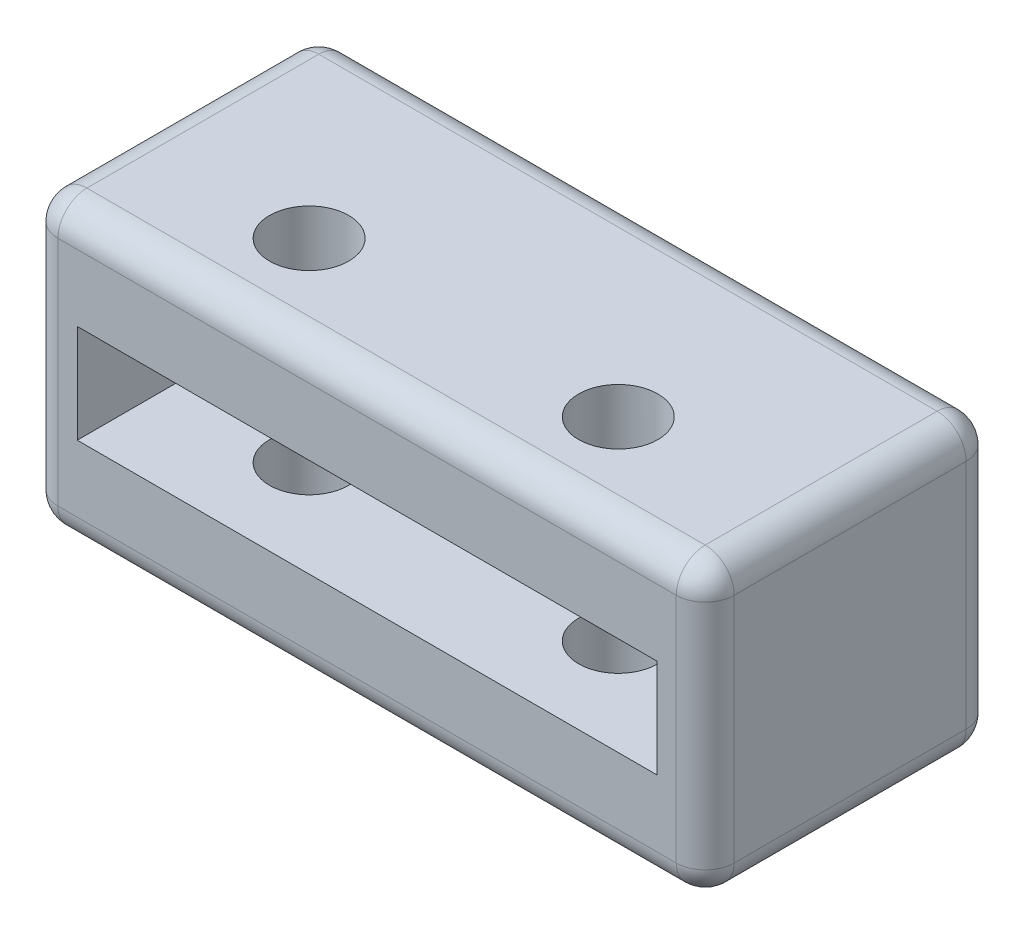
ISO-10303-21;
HEADER;
FILE_DESCRIPTION(('STEP AP214'),'2;1');
FILE_NAME('part.step','',(''),(''),'','','');
FILE_SCHEMA(('AUTOMOTIVE_DESIGN { 1 0 10303 214 1 1 1 1 }'));
ENDSEC;
DATA;
#1=APPLICATION_CONTEXT('core data for automotive mechanical design processes');
#2=APPLICATION_PROTOCOL_DEFINITION('international standard','automotive_design',2000,#1);
#3=PRODUCT_CONTEXT('',#1,'mechanical');
#4=PRODUCT('Part','Part','',(#3));
#5=PRODUCT_RELATED_PRODUCT_CATEGORY('part','',(#4));
#6=PRODUCT_DEFINITION_FORMATION('','',#4);
#7=PRODUCT_DEFINITION_CONTEXT('part definition',#1,'design');
#8=PRODUCT_DEFINITION('design','',#6,#7);
#9=PRODUCT_DEFINITION_SHAPE('','',#8);
#10=(LENGTH_UNIT() NAMED_UNIT(*) SI_UNIT(.MILLI.,.METRE.));
#11=(NAMED_UNIT(*) PLANE_ANGLE_UNIT() SI_UNIT($,.RADIAN.));
#12=(NAMED_UNIT(*) SI_UNIT($,.STERADIAN.) SOLID_ANGLE_UNIT());
#13=UNCERTAINTY_MEASURE_WITH_UNIT(LENGTH_MEASURE(1.E-05),#10,'distance_accuracy_value','');
#14=(GEOMETRIC_REPRESENTATION_CONTEXT(3) GLOBAL_UNCERTAINTY_ASSIGNED_CONTEXT((#13)) GLOBAL_UNIT_ASSIGNED_CONTEXT((#10,
#11,#12)) REPRESENTATION_CONTEXT('',''));
#15=CARTESIAN_POINT('',(0.,0.,0.));
#16=DIRECTION('',(0.,0.,1.));
#17=DIRECTION('',(1.,0.,0.));
#18=AXIS2_PLACEMENT_3D('',#15,#16,#17);
#19=CARTESIAN_POINT('',(35.,7.5,-6.));
#20=DIRECTION('',(0.,-1.,0.));
#21=DIRECTION('',(0.,0.,-1.));
#22=AXIS2_PLACEMENT_3D('',#19,#20,#21);
#23=PLANE('',#22);
#24=DIRECTION('',(-1.,0.,0.));
#25=VECTOR('',#24,1.);
#26=CARTESIAN_POINT('',(35.,7.5,6.));
#27=LINE('',#26,#25);
#28=CARTESIAN_POINT('',(33.5,7.5,6.));
#29=VERTEX_POINT('',#28);
#30=CARTESIAN_POINT('',(1.5,7.5,6.));
#31=VERTEX_POINT('',#30);
#32=EDGE_CURVE('E216',#29,#31,#27,.T.);
#33=ORIENTED_EDGE('',*,*,#32,.F.);
#34=DIRECTION('',(0.,0.,1.));
#35=VECTOR('',#34,1.);
#36=CARTESIAN_POINT('',(33.5,7.5,-6.));
#37=LINE('',#36,#35);
#38=CARTESIAN_POINT('',(33.5,7.5,-6.));
#39=VERTEX_POINT('',#38);
#40=EDGE_CURVE('E247',#29,#39,#37,.F.);
#41=ORIENTED_EDGE('',*,*,#40,.T.);
#42=DIRECTION('',(-1.,0.,0.));
#43=VECTOR('',#42,1.);
#44=CARTESIAN_POINT('',(35.,7.5,-6.));
#45=LINE('',#44,#43);
#46=CARTESIAN_POINT('',(1.5,7.5,-6.));
#47=VERTEX_POINT('',#46);
#48=EDGE_CURVE('E219',#39,#47,#45,.T.);
#49=ORIENTED_EDGE('',*,*,#48,.T.);
#50=DIRECTION('',(0.,0.,1.));
#51=VECTOR('',#50,1.);
#52=CARTESIAN_POINT('',(1.5,7.5,6.));
#53=LINE('',#52,#51);
#54=EDGE_CURVE('E245',#47,#31,#53,.T.);
#55=ORIENTED_EDGE('',*,*,#54,.T.);
#56=EDGE_LOOP('',(#33,#41,#49,#55));
#57=FACE_BOUND('',#56,.T.);
#58=CARTESIAN_POINT('',(25.5,7.50000000000001,2.5));
#59=DIRECTION('',(0.,-1.,0.));
#60=DIRECTION('',(1.,0.,0.));
#61=AXIS2_PLACEMENT_3D('',#58,#59,#60);
#62=CIRCLE('',#61,2.05);
#63=CARTESIAN_POINT('',(27.55,7.50000000000001,2.5));
#64=VERTEX_POINT('',#63);
#65=EDGE_CURVE('E699',#64,#64,#62,.T.);
#66=ORIENTED_EDGE('',*,*,#65,.T.);
#67=EDGE_LOOP('',(#66));
#68=FACE_BOUND('',#67,.T.);
#69=CARTESIAN_POINT('',(9.5,7.50000000000001,2.5));
#70=DIRECTION('',(0.,1.,0.));
#71=DIRECTION('',(-1.,0.,0.));
#72=AXIS2_PLACEMENT_3D('',#69,#70,#71);
#73=CIRCLE('',#72,2.05);
#74=CARTESIAN_POINT('',(7.45,7.50000000000001,2.5));
#75=VERTEX_POINT('',#74);
#76=EDGE_CURVE('E702',#75,#75,#73,.T.);
#77=ORIENTED_EDGE('',*,*,#76,.F.);
#78=EDGE_LOOP('',(#77));
#79=FACE_BOUND('',#78,.T.);
#80=ADVANCED_FACE('F35',(#57,#68,#79),#23,.F.);
#81=CARTESIAN_POINT('',(35.,-7.5,-6.));
#82=DIRECTION('',(0.,1.,0.));
#83=DIRECTION('',(0.,0.,1.));
#84=AXIS2_PLACEMENT_3D('',#81,#82,#83);
#85=PLANE('',#84);
#86=DIRECTION('',(-1.,0.,0.));
#87=VECTOR('',#86,1.);
#88=CARTESIAN_POINT('',(35.,-7.5,-6.));
#89=LINE('',#88,#87);
#90=CARTESIAN_POINT('',(33.5,-7.5,-6.));
#91=VERTEX_POINT('',#90);
#92=CARTESIAN_POINT('',(1.5,-7.5,-6.));
#93=VERTEX_POINT('',#92);
#94=EDGE_CURVE('E204',#91,#93,#89,.T.);
#95=ORIENTED_EDGE('',*,*,#94,.F.);
#96=DIRECTION('',(0.,0.,-1.));
#97=VECTOR('',#96,1.);
#98=CARTESIAN_POINT('',(33.5,-7.5,-6.));
#99=LINE('',#98,#97);
#100=CARTESIAN_POINT('',(33.5,-7.5,6.));
#101=VERTEX_POINT('',#100);
#102=EDGE_CURVE('E263',#91,#101,#99,.F.);
#103=ORIENTED_EDGE('',*,*,#102,.T.);
#104=DIRECTION('',(-1.,0.,0.));
#105=VECTOR('',#104,1.);
#106=CARTESIAN_POINT('',(35.,-7.5,6.));
#107=LINE('',#106,#105);
#108=CARTESIAN_POINT('',(1.5,-7.5,6.));
#109=VERTEX_POINT('',#108);
#110=EDGE_CURVE('E207',#101,#109,#107,.T.);
#111=ORIENTED_EDGE('',*,*,#110,.T.);
#112=DIRECTION('',(0.,0.,-1.));
#113=VECTOR('',#112,1.);
#114=CARTESIAN_POINT('',(1.5,-7.5,-6.));
#115=LINE('',#114,#113);
#116=EDGE_CURVE('E261',#109,#93,#115,.T.);
#117=ORIENTED_EDGE('',*,*,#116,.T.);
#118=EDGE_LOOP('',(#95,#103,#111,#117));
#119=FACE_BOUND('',#118,.T.);
#120=CARTESIAN_POINT('',(25.5,-7.5,2.5));
#121=DIRECTION('',(0.,-1.,0.));
#122=DIRECTION('',(1.,0.,0.));
#123=AXIS2_PLACEMENT_3D('',#120,#121,#122);
#124=CIRCLE('',#123,2.05);
#125=CARTESIAN_POINT('',(27.55,-7.5,2.5));
#126=VERTEX_POINT('',#125);
#127=EDGE_CURVE('E299',#126,#126,#124,.T.);
#128=ORIENTED_EDGE('',*,*,#127,.F.);
#129=EDGE_LOOP('',(#128));
#130=FACE_BOUND('',#129,.T.);
#131=CARTESIAN_POINT('',(9.50000000000001,-7.50000000000001,2.5));
#132=DIRECTION('',(0.,1.,0.));
#133=DIRECTION('',(-1.,0.,0.));
#134=AXIS2_PLACEMENT_3D('',#131,#132,#133);
#135=CIRCLE('',#134,2.05);
#136=CARTESIAN_POINT('',(7.45000000000001,-7.50000000000001,2.5));
#137=VERTEX_POINT('',#136);
#138=EDGE_CURVE('E227',#137,#137,#135,.T.);
#139=ORIENTED_EDGE('',*,*,#138,.T.);
#140=EDGE_LOOP('',(#139));
#141=FACE_BOUND('',#140,.T.);
#142=ADVANCED_FACE('F396',(#119,#130,#141),#85,.F.);
#143=CARTESIAN_POINT('',(32.5,2.55000000000001,-2.5));
#144=DIRECTION('',(0.,1.,0.));
#145=DIRECTION('',(-1.,0.,0.));
#146=AXIS2_PLACEMENT_3D('',#143,#144,#145);
#147=PLANE('',#146);
#148=DIRECTION('',(-1.,0.,0.));
#149=VECTOR('',#148,1.);
#150=CARTESIAN_POINT('',(32.5,2.55000000000001,7.5));
#151=LINE('',#150,#149);
#152=CARTESIAN_POINT('',(32.5,2.55000000000001,7.5));
#153=VERTEX_POINT('',#152);
#154=CARTESIAN_POINT('',(2.50000000000001,2.54999999999999,7.5));
#155=VERTEX_POINT('',#154);
#156=EDGE_CURVE('E177',#153,#155,#151,.T.);
#157=ORIENTED_EDGE('',*,*,#156,.T.);
#158=DIRECTION('',(0.,0.,1.));
#159=VECTOR('',#158,1.);
#160=CARTESIAN_POINT('',(2.50000000000001,2.54999999999999,-2.5));
#161=LINE('',#160,#159);
#162=CARTESIAN_POINT('',(2.50000000000001,2.54999999999999,-2.5));
#163=VERTEX_POINT('',#162);
#164=EDGE_CURVE('E193',#163,#155,#161,.T.);
#165=ORIENTED_EDGE('',*,*,#164,.F.);
#166=DIRECTION('',(-1.,0.,0.));
#167=VECTOR('',#166,1.);
#168=CARTESIAN_POINT('',(32.5,2.55000000000001,-2.5));
#169=LINE('',#168,#167);
#170=CARTESIAN_POINT('',(32.5,2.55000000000001,-2.5));
#171=VERTEX_POINT('',#170);
#172=EDGE_CURVE('E164',#171,#163,#169,.T.);
#173=ORIENTED_EDGE('',*,*,#172,.F.);
#174=DIRECTION('',(0.,0.,1.));
#175=VECTOR('',#174,1.);
#176=CARTESIAN_POINT('',(32.5,2.55000000000001,-2.5));
#177=LINE('',#176,#175);
#178=EDGE_CURVE('E196',#171,#153,#177,.T.);
#179=ORIENTED_EDGE('',*,*,#178,.T.);
#180=EDGE_LOOP('',(#157,#165,#173,#179));
#181=FACE_BOUND('',#180,.T.);
#182=CARTESIAN_POINT('',(25.5,2.55,2.5));
#183=DIRECTION('',(0.,1.,0.));
#184=DIRECTION('',(-1.,0.,0.));
#185=AXIS2_PLACEMENT_3D('',#182,#183,#184);
#186=CIRCLE('',#185,2.05);
#187=CARTESIAN_POINT('',(23.45,2.55,2.5));
#188=VERTEX_POINT('',#187);
#189=EDGE_CURVE('E226',#188,#188,#186,.F.);
#190=ORIENTED_EDGE('',*,*,#189,.F.);
#191=EDGE_LOOP('',(#190));
#192=FACE_BOUND('',#191,.T.);
#193=CARTESIAN_POINT('',(9.5,2.54999999999999,2.5));
#194=DIRECTION('',(0.,1.,0.));
#195=DIRECTION('',(-1.,0.,0.));
#196=AXIS2_PLACEMENT_3D('',#193,#194,#195);
#197=CIRCLE('',#196,2.05);
#198=CARTESIAN_POINT('',(7.45,2.54999999999999,2.5));
#199=VERTEX_POINT('',#198);
#200=EDGE_CURVE('E183',#199,#199,#197,.T.);
#201=ORIENTED_EDGE('',*,*,#200,.T.);
#202=EDGE_LOOP('',(#201));
#203=FACE_BOUND('',#202,.T.);
#204=ADVANCED_FACE('F401',(#181,#192,#203),#147,.F.);
#205=CARTESIAN_POINT('',(32.5,-2.54999999999999,-2.5));
#206=DIRECTION('',(0.,-1.,0.));
#207=DIRECTION('',(1.,0.,0.));
#208=AXIS2_PLACEMENT_3D('',#205,#206,#207);
#209=PLANE('',#208);
#210=DIRECTION('',(1.,0.,0.));
#211=VECTOR('',#210,1.);
#212=CARTESIAN_POINT('',(32.5,-2.54999999999999,7.5));
#213=LINE('',#212,#211);
#214=CARTESIAN_POINT('',(2.50000000000001,-2.55,7.5));
#215=VERTEX_POINT('',#214);
#216=CARTESIAN_POINT('',(32.5,-2.54999999999999,7.5));
#217=VERTEX_POINT('',#216);
#218=EDGE_CURVE('E189',#215,#217,#213,.T.);
#219=ORIENTED_EDGE('',*,*,#218,.T.);
#220=DIRECTION('',(0.,0.,1.));
#221=VECTOR('',#220,1.);
#222=CARTESIAN_POINT('',(32.5,-2.54999999999999,-2.5));
#223=LINE('',#222,#221);
#224=CARTESIAN_POINT('',(32.5,-2.54999999999999,-2.5));
#225=VERTEX_POINT('',#224);
#226=EDGE_CURVE('E163',#225,#217,#223,.T.);
#227=ORIENTED_EDGE('',*,*,#226,.F.);
#228=DIRECTION('',(1.,0.,0.));
#229=VECTOR('',#228,1.);
#230=CARTESIAN_POINT('',(32.5,-2.54999999999999,-2.5));
#231=LINE('',#230,#229);
#232=CARTESIAN_POINT('',(2.50000000000001,-2.55000000000001,-2.5));
#233=VERTEX_POINT('',#232);
#234=EDGE_CURVE('E167',#233,#225,#231,.T.);
#235=ORIENTED_EDGE('',*,*,#234,.F.);
#236=DIRECTION('',(0.,0.,1.));
#237=VECTOR('',#236,1.);
#238=CARTESIAN_POINT('',(2.50000000000001,-2.55000000000001,-2.5));
#239=LINE('',#238,#237);
#240=EDGE_CURVE('E152',#233,#215,#239,.T.);
#241=ORIENTED_EDGE('',*,*,#240,.T.);
#242=EDGE_LOOP('',(#219,#227,#235,#241));
#243=FACE_BOUND('',#242,.T.);
#244=CARTESIAN_POINT('',(25.5,-2.55,2.5));
#245=DIRECTION('',(0.,-1.,0.));
#246=DIRECTION('',(1.,0.,0.));
#247=AXIS2_PLACEMENT_3D('',#244,#245,#246);
#248=CIRCLE('',#247,2.05);
#249=CARTESIAN_POINT('',(27.55,-2.54999999999999,2.5));
#250=VERTEX_POINT('',#249);
#251=EDGE_CURVE('E223',#250,#250,#248,.F.);
#252=ORIENTED_EDGE('',*,*,#251,.F.);
#253=EDGE_LOOP('',(#252));
#254=FACE_BOUND('',#253,.T.);
#255=CARTESIAN_POINT('',(9.5,-2.55,2.5));
#256=DIRECTION('',(0.,-1.,0.));
#257=DIRECTION('',(1.,0.,0.));
#258=AXIS2_PLACEMENT_3D('',#255,#256,#257);
#259=CIRCLE('',#258,2.05);
#260=CARTESIAN_POINT('',(11.55,-2.55,2.5));
#261=VERTEX_POINT('',#260);
#262=EDGE_CURVE('E228',#261,#261,#259,.T.);
#263=ORIENTED_EDGE('',*,*,#262,.T.);
#264=EDGE_LOOP('',(#263));
#265=FACE_BOUND('',#264,.T.);
#266=ADVANCED_FACE('F168',(#243,#254,#265),#209,.F.);
#267=CARTESIAN_POINT('',(35.,6.,-6.));
#268=DIRECTION('',(-1.,0.,0.));
#269=DIRECTION('',(0.,0.,1.));
#270=AXIS2_PLACEMENT_3D('',#267,#268,#269);
#271=CYLINDRICAL_SURFACE('',#270,1.5);
#272=ORIENTED_EDGE('',*,*,#48,.F.);
#273=CARTESIAN_POINT('',(33.5,6.,-6.));
#274=DIRECTION('',(-1.,0.,0.));
#275=DIRECTION('',(0.,0.,1.));
#276=AXIS2_PLACEMENT_3D('',#273,#274,#275);
#277=CIRCLE('',#276,1.5);
#278=CARTESIAN_POINT('',(33.5,6.,-7.5));
#279=VERTEX_POINT('',#278);
#280=EDGE_CURVE('E251',#39,#279,#277,.T.);
#281=ORIENTED_EDGE('',*,*,#280,.T.);
#282=DIRECTION('',(-1.,0.,0.));
#283=VECTOR('',#282,1.);
#284=CARTESIAN_POINT('',(35.,6.,-7.5));
#285=LINE('',#284,#283);
#286=CARTESIAN_POINT('',(1.5,6.,-7.5));
#287=VERTEX_POINT('',#286);
#288=EDGE_CURVE('E195',#279,#287,#285,.T.);
#289=ORIENTED_EDGE('',*,*,#288,.T.);
#290=CARTESIAN_POINT('',(1.5,6.,-6.));
#291=DIRECTION('',(-1.,0.,0.));
#292=DIRECTION('',(0.,0.,1.));
#293=AXIS2_PLACEMENT_3D('',#290,#291,#292);
#294=CIRCLE('',#293,1.5);
#295=EDGE_CURVE('E249',#287,#47,#294,.F.);
#296=ORIENTED_EDGE('',*,*,#295,.T.);
#297=EDGE_LOOP('',(#272,#281,#289,#296));
#298=FACE_BOUND('',#297,.T.);
#299=ADVANCED_FACE('F370',(#298),#271,.T.);
#300=CARTESIAN_POINT('',(35.,6.,6.));
#301=DIRECTION('',(-1.,0.,0.));
#302=DIRECTION('',(0.,0.,1.));
#303=AXIS2_PLACEMENT_3D('',#300,#301,#302);
#304=CYLINDRICAL_SURFACE('',#303,1.5);
#305=DIRECTION('',(-1.,0.,0.));
#306=VECTOR('',#305,1.);
#307=CARTESIAN_POINT('',(35.,6.,7.5));
#308=LINE('',#307,#306);
#309=CARTESIAN_POINT('',(33.5,6.,7.5));
#310=VERTEX_POINT('',#309);
#311=CARTESIAN_POINT('',(1.5,6.,7.5));
#312=VERTEX_POINT('',#311);
#313=EDGE_CURVE('E213',#310,#312,#308,.T.);
#314=ORIENTED_EDGE('',*,*,#313,.F.);
#315=CARTESIAN_POINT('',(33.5,6.,6.));
#316=DIRECTION('',(-1.,0.,0.));
#317=DIRECTION('',(0.,0.,1.));
#318=AXIS2_PLACEMENT_3D('',#315,#316,#317);
#319=CIRCLE('',#318,1.5);
#320=EDGE_CURVE('E233',#310,#29,#319,.T.);
#321=ORIENTED_EDGE('',*,*,#320,.T.);
#322=ORIENTED_EDGE('',*,*,#32,.T.);
#323=CARTESIAN_POINT('',(1.5,6.,6.));
#324=DIRECTION('',(-1.,0.,0.));
#325=DIRECTION('',(0.,0.,1.));
#326=AXIS2_PLACEMENT_3D('',#323,#324,#325);
#327=CIRCLE('',#326,1.5);
#328=EDGE_CURVE('E222',#31,#312,#327,.F.);
#329=ORIENTED_EDGE('',*,*,#328,.T.);
#330=EDGE_LOOP('',(#314,#321,#322,#329));
#331=FACE_BOUND('',#330,.T.);
#332=ADVANCED_FACE('F344',(#331),#304,.T.);
#333=CARTESIAN_POINT('',(35.,6.,7.5));
#334=DIRECTION('',(0.,0.,-1.));
#335=DIRECTION('',(0.,1.,0.));
#336=AXIS2_PLACEMENT_3D('',#333,#334,#335);
#337=PLANE('',#336);
#338=ORIENTED_EDGE('',*,*,#218,.F.);
#339=DIRECTION('',(0.,-1.,0.));
#340=VECTOR('',#339,1.);
#341=CARTESIAN_POINT('',(2.50000000000001,2.54999999999999,7.5));
#342=LINE('',#341,#340);
#343=EDGE_CURVE('E159',#155,#215,#342,.T.);
#344=ORIENTED_EDGE('',*,*,#343,.F.);
#345=ORIENTED_EDGE('',*,*,#156,.F.);
#346=DIRECTION('',(0.,1.,0.));
#347=VECTOR('',#346,1.);
#348=CARTESIAN_POINT('',(32.5,2.55000000000001,7.5));
#349=LINE('',#348,#347);
#350=EDGE_CURVE('E180',#217,#153,#349,.T.);
#351=ORIENTED_EDGE('',*,*,#350,.F.);
#352=EDGE_LOOP('',(#338,#344,#345,#351));
#353=FACE_BOUND('',#352,.T.);
#354=DIRECTION('',(-1.,0.,0.));
#355=VECTOR('',#354,1.);
#356=CARTESIAN_POINT('',(35.,-6.,7.5));
#357=LINE('',#356,#355);
#358=CARTESIAN_POINT('',(33.5,-6.,7.5));
#359=VERTEX_POINT('',#358);
#360=CARTESIAN_POINT('',(1.5,-6.,7.5));
#361=VERTEX_POINT('',#360);
#362=EDGE_CURVE('E210',#359,#361,#357,.T.);
#363=ORIENTED_EDGE('',*,*,#362,.F.);
#364=DIRECTION('',(0.,-1.,0.));
#365=VECTOR('',#364,1.);
#366=CARTESIAN_POINT('',(33.5,6.,7.5));
#367=LINE('',#366,#365);
#368=EDGE_CURVE('E11',#359,#310,#367,.F.);
#369=ORIENTED_EDGE('',*,*,#368,.T.);
#370=ORIENTED_EDGE('',*,*,#313,.T.);
#371=DIRECTION('',(0.,-1.,0.));
#372=VECTOR('',#371,1.);
#373=CARTESIAN_POINT('',(1.5,-6.,7.5));
#374=LINE('',#373,#372);
#375=EDGE_CURVE('E44',#312,#361,#374,.T.);
#376=ORIENTED_EDGE('',*,*,#375,.T.);
#377=EDGE_LOOP('',(#363,#369,#370,#376));
#378=FACE_BOUND('',#377,.T.);
#379=ADVANCED_FACE('F347',(#353,#378),#337,.F.);
#380=CARTESIAN_POINT('',(35.,-6.,6.));
#381=DIRECTION('',(-1.,0.,0.));
#382=DIRECTION('',(0.,0.,1.));
#383=AXIS2_PLACEMENT_3D('',#380,#381,#382);
#384=CYLINDRICAL_SURFACE('',#383,1.5);
#385=ORIENTED_EDGE('',*,*,#110,.F.);
#386=CARTESIAN_POINT('',(33.5,-6.,6.));
#387=DIRECTION('',(-1.,0.,0.));
#388=DIRECTION('',(0.,0.,1.));
#389=AXIS2_PLACEMENT_3D('',#386,#387,#388);
#390=CIRCLE('',#389,1.5);
#391=EDGE_CURVE('E267',#101,#359,#390,.T.);
#392=ORIENTED_EDGE('',*,*,#391,.T.);
#393=ORIENTED_EDGE('',*,*,#362,.T.);
#394=CARTESIAN_POINT('',(1.5,-6.,6.));
#395=DIRECTION('',(-1.,0.,0.));
#396=DIRECTION('',(0.,0.,1.));
#397=AXIS2_PLACEMENT_3D('',#394,#395,#396);
#398=CIRCLE('',#397,1.5);
#399=EDGE_CURVE('E265',#361,#109,#398,.F.);
#400=ORIENTED_EDGE('',*,*,#399,.T.);
#401=EDGE_LOOP('',(#385,#392,#393,#400));
#402=FACE_BOUND('',#401,.T.);
#403=ADVANCED_FACE('F639',(#402),#384,.T.);
#404=CARTESIAN_POINT('',(35.,-6.,-6.));
#405=DIRECTION('',(-1.,0.,0.));
#406=DIRECTION('',(0.,0.,1.));
#407=AXIS2_PLACEMENT_3D('',#404,#405,#406);
#408=CYLINDRICAL_SURFACE('',#407,1.5);
#409=DIRECTION('',(-1.,0.,0.));
#410=VECTOR('',#409,1.);
#411=CARTESIAN_POINT('',(35.,-6.,-7.5));
#412=LINE('',#411,#410);
#413=CARTESIAN_POINT('',(33.5,-6.,-7.5));
#414=VERTEX_POINT('',#413);
#415=CARTESIAN_POINT('',(1.5,-6.,-7.5));
#416=VERTEX_POINT('',#415);
#417=EDGE_CURVE('E201',#414,#416,#412,.T.);
#418=ORIENTED_EDGE('',*,*,#417,.F.);
#419=CARTESIAN_POINT('',(33.5,-6.,-6.));
#420=DIRECTION('',(-1.,0.,0.));
#421=DIRECTION('',(0.,0.,1.));
#422=AXIS2_PLACEMENT_3D('',#419,#420,#421);
#423=CIRCLE('',#422,1.5);
#424=EDGE_CURVE('E259',#414,#91,#423,.T.);
#425=ORIENTED_EDGE('',*,*,#424,.T.);
#426=ORIENTED_EDGE('',*,*,#94,.T.);
#427=CARTESIAN_POINT('',(1.5,-6.,-6.));
#428=DIRECTION('',(-1.,0.,0.));
#429=DIRECTION('',(0.,0.,1.));
#430=AXIS2_PLACEMENT_3D('',#427,#428,#429);
#431=CIRCLE('',#430,1.5);
#432=EDGE_CURVE('E257',#93,#416,#431,.F.);
#433=ORIENTED_EDGE('',*,*,#432,.T.);
#434=EDGE_LOOP('',(#418,#425,#426,#433));
#435=FACE_BOUND('',#434,.T.);
#436=ADVANCED_FACE('F631',(#435),#408,.T.);
#437=CARTESIAN_POINT('',(35.,6.,-7.5));
#438=DIRECTION('',(0.,0.,1.));
#439=DIRECTION('',(0.,-1.,0.));
#440=AXIS2_PLACEMENT_3D('',#437,#438,#439);
#441=PLANE('',#440);
#442=ORIENTED_EDGE('',*,*,#288,.F.);
#443=DIRECTION('',(0.,1.,0.));
#444=VECTOR('',#443,1.);
#445=CARTESIAN_POINT('',(33.5,6.,-7.5));
#446=LINE('',#445,#444);
#447=EDGE_CURVE('E255',#279,#414,#446,.F.);
#448=ORIENTED_EDGE('',*,*,#447,.T.);
#449=ORIENTED_EDGE('',*,*,#417,.T.);
#450=DIRECTION('',(0.,1.,0.));
#451=VECTOR('',#450,1.);
#452=CARTESIAN_POINT('',(1.5,6.,-7.5));
#453=LINE('',#452,#451);
#454=EDGE_CURVE('E253',#416,#287,#453,.T.);
#455=ORIENTED_EDGE('',*,*,#454,.T.);
#456=EDGE_LOOP('',(#442,#448,#449,#455));
#457=FACE_BOUND('',#456,.T.);
#458=ADVANCED_FACE('F374',(#457),#441,.F.);
#459=CARTESIAN_POINT('',(35.,6.,-6.));
#460=DIRECTION('',(-1.,0.,0.));
#461=DIRECTION('',(0.,0.,1.));
#462=AXIS2_PLACEMENT_3D('',#459,#460,#461);
#463=PLANE('',#462);
#464=DIRECTION('',(0.,1.,0.));
#465=VECTOR('',#464,1.);
#466=CARTESIAN_POINT('',(35.,6.,-6.));
#467=LINE('',#466,#465);
#468=CARTESIAN_POINT('',(35.,-6.,-6.));
#469=VERTEX_POINT('',#468);
#470=CARTESIAN_POINT('',(35.,6.,-6.));
#471=VERTEX_POINT('',#470);
#472=EDGE_CURVE('E240',#469,#471,#467,.T.);
#473=ORIENTED_EDGE('',*,*,#472,.T.);
#474=DIRECTION('',(0.,0.,1.));
#475=VECTOR('',#474,1.);
#476=CARTESIAN_POINT('',(35.,6.,-6.));
#477=LINE('',#476,#475);
#478=CARTESIAN_POINT('',(35.,6.,6.));
#479=VERTEX_POINT('',#478);
#480=EDGE_CURVE('E242',#471,#479,#477,.T.);
#481=ORIENTED_EDGE('',*,*,#480,.T.);
#482=DIRECTION('',(0.,-1.,0.));
#483=VECTOR('',#482,1.);
#484=CARTESIAN_POINT('',(35.,6.,6.));
#485=LINE('',#484,#483);
#486=CARTESIAN_POINT('',(35.,-6.,6.));
#487=VERTEX_POINT('',#486);
#488=EDGE_CURVE('E236',#479,#487,#485,.T.);
#489=ORIENTED_EDGE('',*,*,#488,.T.);
#490=DIRECTION('',(0.,0.,-1.));
#491=VECTOR('',#490,1.);
#492=CARTESIAN_POINT('',(35.,-6.,-6.));
#493=LINE('',#492,#491);
#494=EDGE_CURVE('E238',#487,#469,#493,.T.);
#495=ORIENTED_EDGE('',*,*,#494,.T.);
#496=EDGE_LOOP('',(#473,#481,#489,#495));
#497=FACE_BOUND('',#496,.T.);
#498=ADVANCED_FACE('F615',(#497),#463,.F.);
#499=CARTESIAN_POINT('',(0.,6.,-6.));
#500=DIRECTION('',(-1.,0.,0.));
#501=DIRECTION('',(0.,0.,1.));
#502=AXIS2_PLACEMENT_3D('',#499,#500,#501);
#503=PLANE('',#502);
#504=DIRECTION('',(0.,-1.,0.));
#505=VECTOR('',#504,1.);
#506=CARTESIAN_POINT('',(0.,6.,6.));
#507=LINE('',#506,#505);
#508=CARTESIAN_POINT('',(0.,-6.,6.));
#509=VERTEX_POINT('',#508);
#510=CARTESIAN_POINT('',(0.,6.,6.));
#511=VERTEX_POINT('',#510);
#512=EDGE_CURVE('E269',#509,#511,#507,.F.);
#513=ORIENTED_EDGE('',*,*,#512,.T.);
#514=DIRECTION('',(0.,0.,1.));
#515=VECTOR('',#514,1.);
#516=CARTESIAN_POINT('',(0.,6.,-6.));
#517=LINE('',#516,#515);
#518=CARTESIAN_POINT('',(0.,6.,-6.));
#519=VERTEX_POINT('',#518);
#520=EDGE_CURVE('E274',#511,#519,#517,.F.);
#521=ORIENTED_EDGE('',*,*,#520,.T.);
#522=DIRECTION('',(0.,1.,0.));
#523=VECTOR('',#522,1.);
#524=CARTESIAN_POINT('',(0.,-6.,-6.));
#525=LINE('',#524,#523);
#526=CARTESIAN_POINT('',(0.,-6.,-6.));
#527=VERTEX_POINT('',#526);
#528=EDGE_CURVE('E60',#519,#527,#525,.F.);
#529=ORIENTED_EDGE('',*,*,#528,.T.);
#530=DIRECTION('',(0.,0.,-1.));
#531=VECTOR('',#530,1.);
#532=CARTESIAN_POINT('',(0.,-6.,6.));
#533=LINE('',#532,#531);
#534=EDGE_CURVE('E271',#527,#509,#533,.F.);
#535=ORIENTED_EDGE('',*,*,#534,.T.);
#536=EDGE_LOOP('',(#513,#521,#529,#535));
#537=FACE_BOUND('',#536,.T.);
#538=ADVANCED_FACE('F329',(#537),#503,.T.);
#539=CARTESIAN_POINT('',(2.50000000000001,2.54999999999999,-2.5));
#540=DIRECTION('',(-1.,0.,0.));
#541=DIRECTION('',(0.,-1.,0.));
#542=AXIS2_PLACEMENT_3D('',#539,#540,#541);
#543=PLANE('',#542);
#544=ORIENTED_EDGE('',*,*,#343,.T.);
#545=ORIENTED_EDGE('',*,*,#240,.F.);
#546=DIRECTION('',(0.,-1.,0.));
#547=VECTOR('',#546,1.);
#548=CARTESIAN_POINT('',(2.50000000000001,2.54999999999999,-2.5));
#549=LINE('',#548,#547);
#550=EDGE_CURVE('E156',#163,#233,#549,.T.);
#551=ORIENTED_EDGE('',*,*,#550,.F.);
#552=ORIENTED_EDGE('',*,*,#164,.T.);
#553=EDGE_LOOP('',(#544,#545,#551,#552));
#554=FACE_BOUND('',#553,.T.);
#555=ADVANCED_FACE('F154',(#554),#543,.F.);
#556=CARTESIAN_POINT('',(32.5,2.55000000000001,-2.5));
#557=DIRECTION('',(1.,0.,0.));
#558=DIRECTION('',(0.,0.,-1.));
#559=AXIS2_PLACEMENT_3D('',#556,#557,#558);
#560=PLANE('',#559);
#561=ORIENTED_EDGE('',*,*,#350,.T.);
#562=ORIENTED_EDGE('',*,*,#178,.F.);
#563=DIRECTION('',(0.,1.,0.));
#564=VECTOR('',#563,1.);
#565=CARTESIAN_POINT('',(32.5,2.55000000000001,-2.5));
#566=LINE('',#565,#564);
#567=EDGE_CURVE('E173',#225,#171,#566,.T.);
#568=ORIENTED_EDGE('',*,*,#567,.F.);
#569=ORIENTED_EDGE('',*,*,#226,.T.);
#570=EDGE_LOOP('',(#561,#562,#568,#569));
#571=FACE_BOUND('',#570,.T.);
#572=ADVANCED_FACE('F593',(#571),#560,.F.);
#573=CARTESIAN_POINT('',(0.,0.,-2.5));
#574=DIRECTION('',(0.,0.,-1.));
#575=DIRECTION('',(-1.,0.,0.));
#576=AXIS2_PLACEMENT_3D('',#573,#574,#575);
#577=PLANE('',#576);
#578=ORIENTED_EDGE('',*,*,#550,.T.);
#579=ORIENTED_EDGE('',*,*,#234,.T.);
#580=ORIENTED_EDGE('',*,*,#567,.T.);
#581=ORIENTED_EDGE('',*,*,#172,.T.);
#582=EDGE_LOOP('',(#578,#579,#580,#581));
#583=FACE_BOUND('',#582,.T.);
#584=ADVANCED_FACE('F175',(#583),#577,.F.);
#585=CARTESIAN_POINT('',(25.5,-7.5,2.5));
#586=DIRECTION('',(0.,1.,0.));
#587=DIRECTION('',(-1.,0.,0.));
#588=AXIS2_PLACEMENT_3D('',#585,#586,#587);
#589=CYLINDRICAL_SURFACE('',#588,2.05);
#590=ORIENTED_EDGE('',*,*,#127,.T.);
#591=EDGE_LOOP('',(#590));
#592=FACE_BOUND('',#591,.T.);
#593=ORIENTED_EDGE('',*,*,#251,.T.);
#594=EDGE_LOOP('',(#593));
#595=FACE_BOUND('',#594,.T.);
#596=ADVANCED_FACE('F547',(#592,#595),#589,.F.);
#597=CARTESIAN_POINT('',(9.50000000000001,-7.50000000000001,2.5));
#598=DIRECTION('',(0.,1.,0.));
#599=DIRECTION('',(-1.,0.,0.));
#600=AXIS2_PLACEMENT_3D('',#597,#598,#599);
#601=CYLINDRICAL_SURFACE('',#600,2.05);
#602=ORIENTED_EDGE('',*,*,#138,.F.);
#603=EDGE_LOOP('',(#602));
#604=FACE_BOUND('',#603,.T.);
#605=ORIENTED_EDGE('',*,*,#262,.F.);
#606=EDGE_LOOP('',(#605));
#607=FACE_BOUND('',#606,.T.);
#608=ADVANCED_FACE('F538',(#604,#607),#601,.F.);
#609=ORIENTED_EDGE('',*,*,#65,.F.);
#610=EDGE_LOOP('',(#609));
#611=FACE_BOUND('',#610,.T.);
#612=ORIENTED_EDGE('',*,*,#189,.T.);
#613=EDGE_LOOP('',(#612));
#614=FACE_BOUND('',#613,.T.);
#615=ADVANCED_FACE('F535',(#611,#614),#589,.F.);
#616=ORIENTED_EDGE('',*,*,#76,.T.);
#617=EDGE_LOOP('',(#616));
#618=FACE_BOUND('',#617,.T.);
#619=ORIENTED_EDGE('',*,*,#200,.F.);
#620=EDGE_LOOP('',(#619));
#621=FACE_BOUND('',#620,.T.);
#622=ADVANCED_FACE('F525',(#618,#621),#601,.F.);
#623=CARTESIAN_POINT('',(33.5,-6.,-6.));
#624=DIRECTION('',(-1.,0.,0.));
#625=DIRECTION('',(0.,0.,1.));
#626=AXIS2_PLACEMENT_3D('',#623,#624,#625);
#627=SPHERICAL_SURFACE('',#626,1.5);
#628=CARTESIAN_POINT('',(33.5,-6.,-6.));
#629=DIRECTION('',(0.,0.,1.));
#630=DIRECTION('',(1.,0.,0.));
#631=AXIS2_PLACEMENT_3D('',#628,#629,#630);
#632=CIRCLE('',#631,1.5);
#633=EDGE_CURVE('E293',#91,#469,#632,.T.);
#634=ORIENTED_EDGE('',*,*,#633,.F.);
#635=ORIENTED_EDGE('',*,*,#424,.F.);
#636=CARTESIAN_POINT('',(33.5,-6.,-6.));
#637=DIRECTION('',(0.,1.,0.));
#638=DIRECTION('',(0.,0.,1.));
#639=AXIS2_PLACEMENT_3D('',#636,#637,#638);
#640=CIRCLE('',#639,1.5);
#641=EDGE_CURVE('E296',#469,#414,#640,.T.);
#642=ORIENTED_EDGE('',*,*,#641,.F.);
#643=EDGE_LOOP('',(#634,#635,#642));
#644=FACE_BOUND('',#643,.T.);
#645=ADVANCED_FACE('F517',(#644),#627,.T.);
#646=CARTESIAN_POINT('',(33.5,6.,-6.));
#647=DIRECTION('',(0.,1.,0.));
#648=DIRECTION('',(0.,0.,1.));
#649=AXIS2_PLACEMENT_3D('',#646,#647,#648);
#650=CYLINDRICAL_SURFACE('',#649,1.5);
#651=ORIENTED_EDGE('',*,*,#641,.T.);
#652=ORIENTED_EDGE('',*,*,#447,.F.);
#653=CARTESIAN_POINT('',(33.5,6.,-6.));
#654=DIRECTION('',(0.,1.,0.));
#655=DIRECTION('',(0.,0.,1.));
#656=AXIS2_PLACEMENT_3D('',#653,#654,#655);
#657=CIRCLE('',#656,1.5);
#658=EDGE_CURVE('E290',#471,#279,#657,.T.);
#659=ORIENTED_EDGE('',*,*,#658,.F.);
#660=ORIENTED_EDGE('',*,*,#472,.F.);
#661=EDGE_LOOP('',(#651,#652,#659,#660));
#662=FACE_BOUND('',#661,.T.);
#663=ADVANCED_FACE('F378',(#662),#650,.T.);
#664=CARTESIAN_POINT('',(33.5,-6.,-6.));
#665=DIRECTION('',(0.,0.,-1.));
#666=DIRECTION('',(0.,1.,0.));
#667=AXIS2_PLACEMENT_3D('',#664,#665,#666);
#668=CYLINDRICAL_SURFACE('',#667,1.5);
#669=ORIENTED_EDGE('',*,*,#633,.T.);
#670=ORIENTED_EDGE('',*,*,#494,.F.);
#671=CARTESIAN_POINT('',(33.5,-6.,6.));
#672=DIRECTION('',(0.,0.,1.));
#673=DIRECTION('',(1.,0.,0.));
#674=AXIS2_PLACEMENT_3D('',#671,#672,#673);
#675=CIRCLE('',#674,1.5);
#676=EDGE_CURVE('E287',#101,#487,#675,.T.);
#677=ORIENTED_EDGE('',*,*,#676,.F.);
#678=ORIENTED_EDGE('',*,*,#102,.F.);
#679=EDGE_LOOP('',(#669,#670,#677,#678));
#680=FACE_BOUND('',#679,.T.);
#681=ADVANCED_FACE('F385',(#680),#668,.T.);
#682=CARTESIAN_POINT('',(33.5,6.,-6.));
#683=DIRECTION('',(-1.,0.,0.));
#684=DIRECTION('',(0.,0.,1.));
#685=AXIS2_PLACEMENT_3D('',#682,#683,#684);
#686=SPHERICAL_SURFACE('',#685,1.5);
#687=ORIENTED_EDGE('',*,*,#658,.T.);
#688=ORIENTED_EDGE('',*,*,#280,.F.);
#689=CARTESIAN_POINT('',(33.5,6.,-6.));
#690=DIRECTION('',(0.,0.,1.));
#691=DIRECTION('',(1.,0.,0.));
#692=AXIS2_PLACEMENT_3D('',#689,#690,#691);
#693=CIRCLE('',#692,1.5);
#694=EDGE_CURVE('E284',#471,#39,#693,.T.);
#695=ORIENTED_EDGE('',*,*,#694,.F.);
#696=EDGE_LOOP('',(#687,#688,#695));
#697=FACE_BOUND('',#696,.T.);
#698=ADVANCED_FACE('F382',(#697),#686,.T.);
#699=CARTESIAN_POINT('',(33.5,-6.,6.));
#700=DIRECTION('',(-1.,0.,0.));
#701=DIRECTION('',(0.,0.,1.));
#702=AXIS2_PLACEMENT_3D('',#699,#700,#701);
#703=SPHERICAL_SURFACE('',#702,1.5);
#704=ORIENTED_EDGE('',*,*,#391,.F.);
#705=ORIENTED_EDGE('',*,*,#676,.T.);
#706=CARTESIAN_POINT('',(33.5,-6.,6.));
#707=DIRECTION('',(0.,1.,0.));
#708=DIRECTION('',(0.,0.,1.));
#709=AXIS2_PLACEMENT_3D('',#706,#707,#708);
#710=CIRCLE('',#709,1.5);
#711=EDGE_CURVE('E281',#359,#487,#710,.T.);
#712=ORIENTED_EDGE('',*,*,#711,.F.);
#713=EDGE_LOOP('',(#704,#705,#712));
#714=FACE_BOUND('',#713,.T.);
#715=ADVANCED_FACE('F384',(#714),#703,.T.);
#716=CARTESIAN_POINT('',(33.5,6.,-6.));
#717=DIRECTION('',(0.,0.,1.));
#718=DIRECTION('',(0.,-1.,0.));
#719=AXIS2_PLACEMENT_3D('',#716,#717,#718);
#720=CYLINDRICAL_SURFACE('',#719,1.5);
#721=ORIENTED_EDGE('',*,*,#694,.T.);
#722=ORIENTED_EDGE('',*,*,#40,.F.);
#723=CARTESIAN_POINT('',(33.5,6.,6.));
#724=DIRECTION('',(0.,0.,1.));
#725=DIRECTION('',(1.,0.,0.));
#726=AXIS2_PLACEMENT_3D('',#723,#724,#725);
#727=CIRCLE('',#726,1.5);
#728=EDGE_CURVE('E279',#479,#29,#727,.T.);
#729=ORIENTED_EDGE('',*,*,#728,.F.);
#730=ORIENTED_EDGE('',*,*,#480,.F.);
#731=EDGE_LOOP('',(#721,#722,#729,#730));
#732=FACE_BOUND('',#731,.T.);
#733=ADVANCED_FACE('F360',(#732),#720,.T.);
#734=CARTESIAN_POINT('',(33.5,6.,6.));
#735=DIRECTION('',(0.,-1.,0.));
#736=DIRECTION('',(0.,0.,-1.));
#737=AXIS2_PLACEMENT_3D('',#734,#735,#736);
#738=CYLINDRICAL_SURFACE('',#737,1.5);
#739=ORIENTED_EDGE('',*,*,#711,.T.);
#740=ORIENTED_EDGE('',*,*,#488,.F.);
#741=CARTESIAN_POINT('',(33.5,6.,6.));
#742=DIRECTION('',(0.,1.,0.));
#743=DIRECTION('',(0.,0.,1.));
#744=AXIS2_PLACEMENT_3D('',#741,#742,#743);
#745=CIRCLE('',#744,1.5);
#746=EDGE_CURVE('E277',#310,#479,#745,.T.);
#747=ORIENTED_EDGE('',*,*,#746,.F.);
#748=ORIENTED_EDGE('',*,*,#368,.F.);
#749=EDGE_LOOP('',(#739,#740,#747,#748));
#750=FACE_BOUND('',#749,.T.);
#751=ADVANCED_FACE('F352',(#750),#738,.T.);
#752=CARTESIAN_POINT('',(33.5,6.,6.));
#753=DIRECTION('',(-1.,0.,0.));
#754=DIRECTION('',(0.,0.,1.));
#755=AXIS2_PLACEMENT_3D('',#752,#753,#754);
#756=SPHERICAL_SURFACE('',#755,1.5);
#757=ORIENTED_EDGE('',*,*,#728,.T.);
#758=ORIENTED_EDGE('',*,*,#320,.F.);
#759=ORIENTED_EDGE('',*,*,#746,.T.);
#760=EDGE_LOOP('',(#757,#758,#759));
#761=FACE_BOUND('',#760,.T.);
#762=ADVANCED_FACE('F356',(#761),#756,.T.);
#763=CARTESIAN_POINT('',(1.5,-6.,-6.));
#764=DIRECTION('',(-1.,0.,0.));
#765=DIRECTION('',(0.,0.,1.));
#766=AXIS2_PLACEMENT_3D('',#763,#764,#765);
#767=SPHERICAL_SURFACE('',#766,1.5);
#768=CARTESIAN_POINT('',(1.5,-6.,-6.));
#769=DIRECTION('',(0.,0.,1.));
#770=DIRECTION('',(1.,0.,0.));
#771=AXIS2_PLACEMENT_3D('',#768,#769,#770);
#772=CIRCLE('',#771,1.5);
#773=EDGE_CURVE('E313',#527,#93,#772,.T.);
#774=ORIENTED_EDGE('',*,*,#773,.F.);
#775=CARTESIAN_POINT('',(1.5,-6.,-6.));
#776=DIRECTION('',(0.,1.,0.));
#777=DIRECTION('',(0.,0.,1.));
#778=AXIS2_PLACEMENT_3D('',#775,#776,#777);
#779=CIRCLE('',#778,1.5);
#780=EDGE_CURVE('E39',#416,#527,#779,.T.);
#781=ORIENTED_EDGE('',*,*,#780,.F.);
#782=ORIENTED_EDGE('',*,*,#432,.F.);
#783=EDGE_LOOP('',(#774,#781,#782));
#784=FACE_BOUND('',#783,.T.);
#785=ADVANCED_FACE('F37',(#784),#767,.T.);
#786=CARTESIAN_POINT('',(1.5,6.,-6.));
#787=DIRECTION('',(0.,-1.,0.));
#788=DIRECTION('',(0.,0.,-1.));
#789=AXIS2_PLACEMENT_3D('',#786,#787,#788);
#790=CYLINDRICAL_SURFACE('',#789,1.5);
#791=ORIENTED_EDGE('',*,*,#780,.T.);
#792=ORIENTED_EDGE('',*,*,#528,.F.);
#793=CARTESIAN_POINT('',(1.5,6.,-6.));
#794=DIRECTION('',(0.,1.,0.));
#795=DIRECTION('',(0.,0.,1.));
#796=AXIS2_PLACEMENT_3D('',#793,#794,#795);
#797=CIRCLE('',#796,1.5);
#798=EDGE_CURVE('E312',#287,#519,#797,.T.);
#799=ORIENTED_EDGE('',*,*,#798,.F.);
#800=ORIENTED_EDGE('',*,*,#454,.F.);
#801=EDGE_LOOP('',(#791,#792,#799,#800));
#802=FACE_BOUND('',#801,.T.);
#803=ADVANCED_FACE('F322',(#802),#790,.T.);
#804=CARTESIAN_POINT('',(1.5,-6.,-6.));
#805=DIRECTION('',(0.,0.,1.));
#806=DIRECTION('',(0.,-1.,0.));
#807=AXIS2_PLACEMENT_3D('',#804,#805,#806);
#808=CYLINDRICAL_SURFACE('',#807,1.5);
#809=ORIENTED_EDGE('',*,*,#773,.T.);
#810=ORIENTED_EDGE('',*,*,#116,.F.);
#811=CARTESIAN_POINT('',(1.5,-6.,6.));
#812=DIRECTION('',(0.,0.,1.));
#813=DIRECTION('',(1.,0.,0.));
#814=AXIS2_PLACEMENT_3D('',#811,#812,#813);
#815=CIRCLE('',#814,1.5);
#816=EDGE_CURVE('E309',#509,#109,#815,.T.);
#817=ORIENTED_EDGE('',*,*,#816,.F.);
#818=ORIENTED_EDGE('',*,*,#534,.F.);
#819=EDGE_LOOP('',(#809,#810,#817,#818));
#820=FACE_BOUND('',#819,.T.);
#821=ADVANCED_FACE('F327',(#820),#808,.T.);
#822=CARTESIAN_POINT('',(1.5,6.,-6.));
#823=DIRECTION('',(-1.,0.,0.));
#824=DIRECTION('',(0.,0.,1.));
#825=AXIS2_PLACEMENT_3D('',#822,#823,#824);
#826=SPHERICAL_SURFACE('',#825,1.5);
#827=ORIENTED_EDGE('',*,*,#295,.F.);
#828=ORIENTED_EDGE('',*,*,#798,.T.);
#829=CARTESIAN_POINT('',(1.5,6.,-6.));
#830=DIRECTION('',(0.,0.,1.));
#831=DIRECTION('',(1.,0.,0.));
#832=AXIS2_PLACEMENT_3D('',#829,#830,#831);
#833=CIRCLE('',#832,1.5);
#834=EDGE_CURVE('E52',#47,#519,#833,.T.);
#835=ORIENTED_EDGE('',*,*,#834,.F.);
#836=EDGE_LOOP('',(#827,#828,#835));
#837=FACE_BOUND('',#836,.T.);
#838=ADVANCED_FACE('F369',(#837),#826,.T.);
#839=CARTESIAN_POINT('',(1.5,-6.,6.));
#840=DIRECTION('',(-1.,0.,0.));
#841=DIRECTION('',(0.,0.,1.));
#842=AXIS2_PLACEMENT_3D('',#839,#840,#841);
#843=SPHERICAL_SURFACE('',#842,1.5);
#844=ORIENTED_EDGE('',*,*,#816,.T.);
#845=ORIENTED_EDGE('',*,*,#399,.F.);
#846=CARTESIAN_POINT('',(1.5,-6.,6.));
#847=DIRECTION('',(0.,1.,0.));
#848=DIRECTION('',(0.,0.,1.));
#849=AXIS2_PLACEMENT_3D('',#846,#847,#848);
#850=CIRCLE('',#849,1.5);
#851=EDGE_CURVE('E305',#509,#361,#850,.T.);
#852=ORIENTED_EDGE('',*,*,#851,.F.);
#853=EDGE_LOOP('',(#844,#845,#852));
#854=FACE_BOUND('',#853,.T.);
#855=ADVANCED_FACE('F448',(#854),#843,.T.);
#856=CARTESIAN_POINT('',(1.5,6.,-6.));
#857=DIRECTION('',(0.,0.,-1.));
#858=DIRECTION('',(0.,1.,0.));
#859=AXIS2_PLACEMENT_3D('',#856,#857,#858);
#860=CYLINDRICAL_SURFACE('',#859,1.5);
#861=ORIENTED_EDGE('',*,*,#834,.T.);
#862=ORIENTED_EDGE('',*,*,#520,.F.);
#863=CARTESIAN_POINT('',(1.5,6.,6.));
#864=DIRECTION('',(0.,0.,1.));
#865=DIRECTION('',(1.,0.,0.));
#866=AXIS2_PLACEMENT_3D('',#863,#864,#865);
#867=CIRCLE('',#866,1.5);
#868=EDGE_CURVE('E302',#31,#511,#867,.T.);
#869=ORIENTED_EDGE('',*,*,#868,.F.);
#870=ORIENTED_EDGE('',*,*,#54,.F.);
#871=EDGE_LOOP('',(#861,#862,#869,#870));
#872=FACE_BOUND('',#871,.T.);
#873=ADVANCED_FACE('F334',(#872),#860,.T.);
#874=CARTESIAN_POINT('',(1.5,6.,6.));
#875=DIRECTION('',(0.,1.,0.));
#876=DIRECTION('',(0.,0.,1.));
#877=AXIS2_PLACEMENT_3D('',#874,#875,#876);
#878=CYLINDRICAL_SURFACE('',#877,1.5);
#879=ORIENTED_EDGE('',*,*,#851,.T.);
#880=ORIENTED_EDGE('',*,*,#375,.F.);
#881=CARTESIAN_POINT('',(1.5,6.,6.));
#882=DIRECTION('',(0.,1.,0.));
#883=DIRECTION('',(0.,0.,1.));
#884=AXIS2_PLACEMENT_3D('',#881,#882,#883);
#885=CIRCLE('',#884,1.5);
#886=EDGE_CURVE('E300',#511,#312,#885,.T.);
#887=ORIENTED_EDGE('',*,*,#886,.F.);
#888=ORIENTED_EDGE('',*,*,#512,.F.);
#889=EDGE_LOOP('',(#879,#880,#887,#888));
#890=FACE_BOUND('',#889,.T.);
#891=ADVANCED_FACE('F339',(#890),#878,.T.);
#892=CARTESIAN_POINT('',(1.5,6.,6.));
#893=DIRECTION('',(-1.,0.,0.));
#894=DIRECTION('',(0.,0.,1.));
#895=AXIS2_PLACEMENT_3D('',#892,#893,#894);
#896=SPHERICAL_SURFACE('',#895,1.5);
#897=ORIENTED_EDGE('',*,*,#328,.F.);
#898=ORIENTED_EDGE('',*,*,#868,.T.);
#899=ORIENTED_EDGE('',*,*,#886,.T.);
#900=EDGE_LOOP('',(#897,#898,#899));
#901=FACE_BOUND('',#900,.T.);
#902=ADVANCED_FACE('F337',(#901),#896,.T.);
#903=CLOSED_SHELL('',(#80,#142,#204,#266,#299,#332,#379,#403,#436,#458,#498,#538,#555,#572,#584,
#596,#608,#615,#622,#645,#663,#681,#698,#715,#733,#751,#762,#785,#803,#821,#838,#855,#873,#891,#902));
#904=MANIFOLD_SOLID_BREP('B2',#903);
#905=ADVANCED_BREP_SHAPE_REPRESENTATION('',(#18,#904),#14);
#906=SHAPE_DEFINITION_REPRESENTATION(#9,#905);
ENDSEC;
END-ISO-10303-21;
